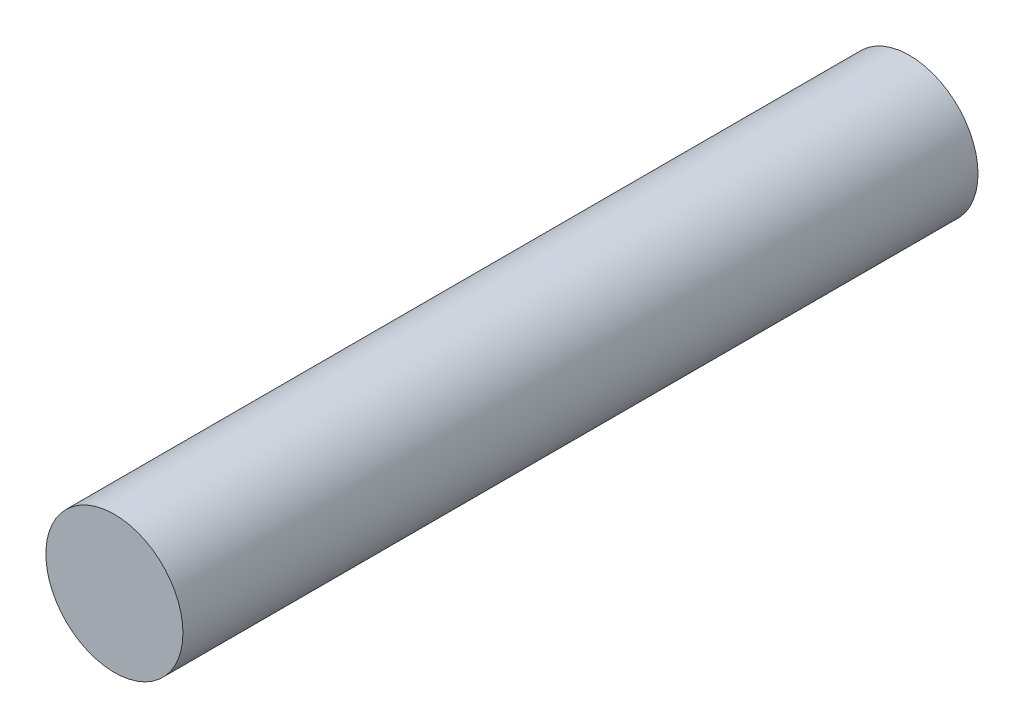
ISO-10303-21;
HEADER;
FILE_DESCRIPTION(('STEP AP214'),'2;1');
FILE_NAME('part.step','',(''),(''),'','','');
FILE_SCHEMA(('AUTOMOTIVE_DESIGN { 1 0 10303 214 1 1 1 1 }'));
ENDSEC;
DATA;
#1=APPLICATION_CONTEXT('core data for automotive mechanical design processes');
#2=APPLICATION_PROTOCOL_DEFINITION('international standard','automotive_design',2000,#1);
#3=PRODUCT_CONTEXT('',#1,'mechanical');
#4=PRODUCT('Part','Part','',(#3));
#5=PRODUCT_RELATED_PRODUCT_CATEGORY('part','',(#4));
#6=PRODUCT_DEFINITION_FORMATION('','',#4);
#7=PRODUCT_DEFINITION_CONTEXT('part definition',#1,'design');
#8=PRODUCT_DEFINITION('design','',#6,#7);
#9=PRODUCT_DEFINITION_SHAPE('','',#8);
#10=(LENGTH_UNIT() NAMED_UNIT(*) SI_UNIT(.MILLI.,.METRE.));
#11=(NAMED_UNIT(*) PLANE_ANGLE_UNIT() SI_UNIT($,.RADIAN.));
#12=(NAMED_UNIT(*) SI_UNIT($,.STERADIAN.) SOLID_ANGLE_UNIT());
#13=UNCERTAINTY_MEASURE_WITH_UNIT(LENGTH_MEASURE(1.E-05),#10,'distance_accuracy_value','');
#14=(GEOMETRIC_REPRESENTATION_CONTEXT(3) GLOBAL_UNCERTAINTY_ASSIGNED_CONTEXT((#13)) GLOBAL_UNIT_ASSIGNED_CONTEXT((#10,
#11,#12)) REPRESENTATION_CONTEXT('',''));
#15=CARTESIAN_POINT('',(0.,0.,0.));
#16=DIRECTION('',(0.,0.,1.));
#17=DIRECTION('',(1.,0.,0.));
#18=AXIS2_PLACEMENT_3D('',#15,#16,#17);
#19=CARTESIAN_POINT('',(0.,0.,36.83));
#20=DIRECTION('',(0.,0.,-1.));
#21=DIRECTION('',(-1.,0.,0.));
#22=AXIS2_PLACEMENT_3D('',#19,#20,#21);
#23=CYLINDRICAL_SURFACE('',#22,3.175);
#24=CARTESIAN_POINT('',(0.,0.,36.83));
#25=DIRECTION('',(0.,0.,1.));
#26=DIRECTION('',(1.,0.,0.));
#27=AXIS2_PLACEMENT_3D('',#24,#25,#26);
#28=CIRCLE('',#27,3.175);
#29=CARTESIAN_POINT('',(3.175,0.,36.83));
#30=VERTEX_POINT('',#29);
#31=EDGE_CURVE('E10',#30,#30,#28,.T.);
#32=ORIENTED_EDGE('',*,*,#31,.F.);
#33=EDGE_LOOP('',(#32));
#34=FACE_BOUND('',#33,.T.);
#35=CARTESIAN_POINT('',(0.,0.,0.));
#36=DIRECTION('',(0.,0.,1.));
#37=DIRECTION('',(1.,0.,0.));
#38=AXIS2_PLACEMENT_3D('',#35,#36,#37);
#39=CIRCLE('',#38,3.175);
#40=CARTESIAN_POINT('',(3.175,0.,0.));
#41=VERTEX_POINT('',#40);
#42=EDGE_CURVE('E33',#41,#41,#39,.T.);
#43=ORIENTED_EDGE('',*,*,#42,.T.);
#44=EDGE_LOOP('',(#43));
#45=FACE_BOUND('',#44,.T.);
#46=ADVANCED_FACE('F30',(#34,#45),#23,.T.);
#47=CARTESIAN_POINT('',(0.,0.,36.83));
#48=DIRECTION('',(0.,0.,1.));
#49=DIRECTION('',(1.,0.,0.));
#50=AXIS2_PLACEMENT_3D('',#47,#48,#49);
#51=PLANE('',#50);
#52=ORIENTED_EDGE('',*,*,#31,.T.);
#53=EDGE_LOOP('',(#52));
#54=FACE_BOUND('',#53,.T.);
#55=ADVANCED_FACE('F45',(#54),#51,.T.);
#56=CARTESIAN_POINT('',(0.,0.,0.));
#57=DIRECTION('',(0.,0.,1.));
#58=DIRECTION('',(1.,0.,0.));
#59=AXIS2_PLACEMENT_3D('',#56,#57,#58);
#60=PLANE('',#59);
#61=ORIENTED_EDGE('',*,*,#42,.F.);
#62=EDGE_LOOP('',(#61));
#63=FACE_BOUND('',#62,.T.);
#64=ADVANCED_FACE('F43',(#63),#60,.F.);
#65=CLOSED_SHELL('',(#46,#55,#64));
#66=MANIFOLD_SOLID_BREP('B2',#65);
#67=ADVANCED_BREP_SHAPE_REPRESENTATION('',(#18,#66),#14);
#68=SHAPE_DEFINITION_REPRESENTATION(#9,#67);
ENDSEC;
END-ISO-10303-21;
